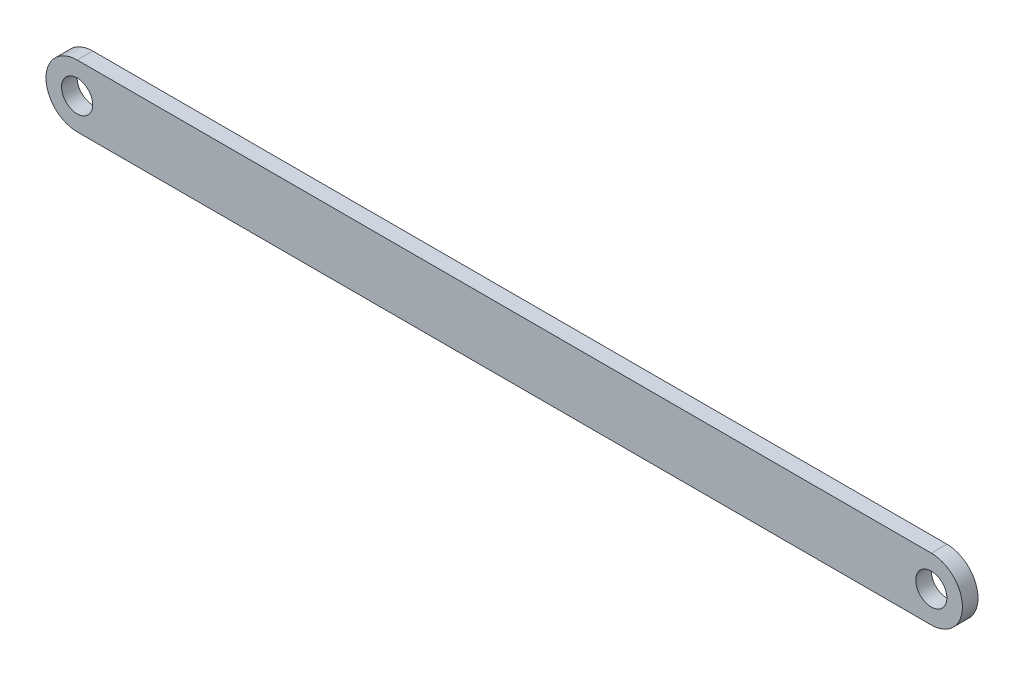
ISO-10303-21;
HEADER;
FILE_DESCRIPTION(('STEP AP214'),'2;1');
FILE_NAME('part.step','',(''),(''),'','','');
FILE_SCHEMA(('AUTOMOTIVE_DESIGN { 1 0 10303 214 1 1 1 1 }'));
ENDSEC;
DATA;
#1=APPLICATION_CONTEXT('core data for automotive mechanical design processes');
#2=APPLICATION_PROTOCOL_DEFINITION('international standard','automotive_design',2000,#1);
#3=PRODUCT_CONTEXT('',#1,'mechanical');
#4=PRODUCT('Part','Part','',(#3));
#5=PRODUCT_RELATED_PRODUCT_CATEGORY('part','',(#4));
#6=PRODUCT_DEFINITION_FORMATION('','',#4);
#7=PRODUCT_DEFINITION_CONTEXT('part definition',#1,'design');
#8=PRODUCT_DEFINITION('design','',#6,#7);
#9=PRODUCT_DEFINITION_SHAPE('','',#8);
#10=(LENGTH_UNIT() NAMED_UNIT(*) SI_UNIT(.MILLI.,.METRE.));
#11=(NAMED_UNIT(*) PLANE_ANGLE_UNIT() SI_UNIT($,.RADIAN.));
#12=(NAMED_UNIT(*) SI_UNIT($,.STERADIAN.) SOLID_ANGLE_UNIT());
#13=UNCERTAINTY_MEASURE_WITH_UNIT(LENGTH_MEASURE(1.E-05),#10,'distance_accuracy_value','');
#14=(GEOMETRIC_REPRESENTATION_CONTEXT(3) GLOBAL_UNCERTAINTY_ASSIGNED_CONTEXT((#13)) GLOBAL_UNIT_ASSIGNED_CONTEXT((#10,
#11,#12)) REPRESENTATION_CONTEXT('',''));
#15=CARTESIAN_POINT('',(0.,0.,0.));
#16=DIRECTION('',(0.,0.,1.));
#17=DIRECTION('',(1.,0.,0.));
#18=AXIS2_PLACEMENT_3D('',#15,#16,#17);
#19=CARTESIAN_POINT('',(27.435,0.,1.));
#20=DIRECTION('',(0.,0.,-1.));
#21=DIRECTION('',(-1.,0.,0.));
#22=AXIS2_PLACEMENT_3D('',#19,#20,#21);
#23=PLANE('',#22);
#24=CARTESIAN_POINT('',(27.435,0.,1.));
#25=DIRECTION('',(0.,0.,1.));
#26=DIRECTION('',(-1.,0.,0.));
#27=AXIS2_PLACEMENT_3D('',#24,#25,#26);
#28=CIRCLE('',#27,2.);
#29=CARTESIAN_POINT('',(27.435,-2.,1.));
#30=VERTEX_POINT('',#29);
#31=CARTESIAN_POINT('',(27.435,2.,1.));
#32=VERTEX_POINT('',#31);
#33=EDGE_CURVE('E94',#30,#32,#28,.T.);
#34=ORIENTED_EDGE('',*,*,#33,.T.);
#35=DIRECTION('',(-1.,0.,0.));
#36=VECTOR('',#35,1.);
#37=CARTESIAN_POINT('',(-27.435,2.,1.));
#38=LINE('',#37,#36);
#39=CARTESIAN_POINT('',(-27.435,2.,1.));
#40=VERTEX_POINT('',#39);
#41=EDGE_CURVE('E89',#32,#40,#38,.T.);
#42=ORIENTED_EDGE('',*,*,#41,.T.);
#43=CARTESIAN_POINT('',(-27.435,0.,1.));
#44=DIRECTION('',(0.,0.,1.));
#45=DIRECTION('',(1.,0.,0.));
#46=AXIS2_PLACEMENT_3D('',#43,#44,#45);
#47=CIRCLE('',#46,2.);
#48=CARTESIAN_POINT('',(-27.435,-2.,1.));
#49=VERTEX_POINT('',#48);
#50=EDGE_CURVE('E92',#40,#49,#47,.T.);
#51=ORIENTED_EDGE('',*,*,#50,.T.);
#52=DIRECTION('',(1.,0.,0.));
#53=VECTOR('',#52,1.);
#54=CARTESIAN_POINT('',(-27.435,-2.,1.));
#55=LINE('',#54,#53);
#56=EDGE_CURVE('E59',#49,#30,#55,.T.);
#57=ORIENTED_EDGE('',*,*,#56,.T.);
#58=EDGE_LOOP('',(#34,#42,#51,#57));
#59=FACE_BOUND('',#58,.T.);
#60=CARTESIAN_POINT('',(-27.435,0.,1.));
#61=DIRECTION('',(0.,0.,1.));
#62=DIRECTION('',(1.,0.,0.));
#63=AXIS2_PLACEMENT_3D('',#60,#61,#62);
#64=CIRCLE('',#63,1.);
#65=CARTESIAN_POINT('',(-26.435,0.,1.));
#66=VERTEX_POINT('',#65);
#67=EDGE_CURVE('E109',#66,#66,#64,.T.);
#68=ORIENTED_EDGE('',*,*,#67,.F.);
#69=EDGE_LOOP('',(#68));
#70=FACE_BOUND('',#69,.T.);
#71=CARTESIAN_POINT('',(27.435,0.,1.));
#72=DIRECTION('',(0.,0.,1.));
#73=DIRECTION('',(1.,0.,0.));
#74=AXIS2_PLACEMENT_3D('',#71,#72,#73);
#75=CIRCLE('',#74,1.);
#76=CARTESIAN_POINT('',(28.435,0.,1.));
#77=VERTEX_POINT('',#76);
#78=EDGE_CURVE('E124',#77,#77,#75,.T.);
#79=ORIENTED_EDGE('',*,*,#78,.F.);
#80=EDGE_LOOP('',(#79));
#81=FACE_BOUND('',#80,.T.);
#82=ADVANCED_FACE('F42',(#59,#70,#81),#23,.F.);
#83=CARTESIAN_POINT('',(27.435,0.,0.));
#84=DIRECTION('',(0.,0.,-1.));
#85=DIRECTION('',(-1.,0.,0.));
#86=AXIS2_PLACEMENT_3D('',#83,#84,#85);
#87=PLANE('',#86);
#88=CARTESIAN_POINT('',(-27.435,0.,0.));
#89=DIRECTION('',(0.,0.,1.));
#90=DIRECTION('',(1.,0.,0.));
#91=AXIS2_PLACEMENT_3D('',#88,#89,#90);
#92=CIRCLE('',#91,1.);
#93=CARTESIAN_POINT('',(-26.435,0.,0.));
#94=VERTEX_POINT('',#93);
#95=EDGE_CURVE('E121',#94,#94,#92,.T.);
#96=ORIENTED_EDGE('',*,*,#95,.T.);
#97=EDGE_LOOP('',(#96));
#98=FACE_BOUND('',#97,.T.);
#99=CARTESIAN_POINT('',(27.435,0.,0.));
#100=DIRECTION('',(0.,0.,1.));
#101=DIRECTION('',(-1.,0.,0.));
#102=AXIS2_PLACEMENT_3D('',#99,#100,#101);
#103=CIRCLE('',#102,2.);
#104=CARTESIAN_POINT('',(27.435,-2.,0.));
#105=VERTEX_POINT('',#104);
#106=CARTESIAN_POINT('',(27.435,2.,0.));
#107=VERTEX_POINT('',#106);
#108=EDGE_CURVE('E106',#105,#107,#103,.T.);
#109=ORIENTED_EDGE('',*,*,#108,.F.);
#110=DIRECTION('',(1.,0.,0.));
#111=VECTOR('',#110,1.);
#112=CARTESIAN_POINT('',(-27.435,-2.,0.));
#113=LINE('',#112,#111);
#114=CARTESIAN_POINT('',(-27.435,-2.,0.));
#115=VERTEX_POINT('',#114);
#116=EDGE_CURVE('E82',#115,#105,#113,.T.);
#117=ORIENTED_EDGE('',*,*,#116,.F.);
#118=CARTESIAN_POINT('',(-27.435,0.,0.));
#119=DIRECTION('',(0.,0.,1.));
#120=DIRECTION('',(1.,0.,0.));
#121=AXIS2_PLACEMENT_3D('',#118,#119,#120);
#122=CIRCLE('',#121,2.);
#123=CARTESIAN_POINT('',(-27.435,2.,0.));
#124=VERTEX_POINT('',#123);
#125=EDGE_CURVE('E76',#124,#115,#122,.T.);
#126=ORIENTED_EDGE('',*,*,#125,.F.);
#127=DIRECTION('',(-1.,0.,0.));
#128=VECTOR('',#127,1.);
#129=CARTESIAN_POINT('',(-27.435,2.,0.));
#130=LINE('',#129,#128);
#131=EDGE_CURVE('E98',#107,#124,#130,.T.);
#132=ORIENTED_EDGE('',*,*,#131,.F.);
#133=EDGE_LOOP('',(#109,#117,#126,#132));
#134=FACE_BOUND('',#133,.T.);
#135=CARTESIAN_POINT('',(27.435,0.,0.));
#136=DIRECTION('',(0.,0.,1.));
#137=DIRECTION('',(1.,0.,0.));
#138=AXIS2_PLACEMENT_3D('',#135,#136,#137);
#139=CIRCLE('',#138,1.);
#140=CARTESIAN_POINT('',(28.435,0.,0.));
#141=VERTEX_POINT('',#140);
#142=EDGE_CURVE('E127',#141,#141,#139,.T.);
#143=ORIENTED_EDGE('',*,*,#142,.T.);
#144=EDGE_LOOP('',(#143));
#145=FACE_BOUND('',#144,.T.);
#146=ADVANCED_FACE('F117',(#98,#134,#145),#87,.T.);
#147=CARTESIAN_POINT('',(27.435,0.,1.));
#148=DIRECTION('',(0.,0.,-1.));
#149=DIRECTION('',(-1.,0.,0.));
#150=AXIS2_PLACEMENT_3D('',#147,#148,#149);
#151=CYLINDRICAL_SURFACE('',#150,2.);
#152=ORIENTED_EDGE('',*,*,#108,.T.);
#153=DIRECTION('',(0.,0.,-1.));
#154=VECTOR('',#153,1.);
#155=CARTESIAN_POINT('',(27.435,2.,1.));
#156=LINE('',#155,#154);
#157=EDGE_CURVE('E11',#32,#107,#156,.T.);
#158=ORIENTED_EDGE('',*,*,#157,.F.);
#159=ORIENTED_EDGE('',*,*,#33,.F.);
#160=DIRECTION('',(0.,0.,-1.));
#161=VECTOR('',#160,1.);
#162=CARTESIAN_POINT('',(27.435,-2.,1.));
#163=LINE('',#162,#161);
#164=EDGE_CURVE('E102',#30,#105,#163,.T.);
#165=ORIENTED_EDGE('',*,*,#164,.T.);
#166=EDGE_LOOP('',(#152,#158,#159,#165));
#167=FACE_BOUND('',#166,.T.);
#168=ADVANCED_FACE('F44',(#167),#151,.T.);
#169=CARTESIAN_POINT('',(-27.435,2.,1.));
#170=DIRECTION('',(0.,-1.,0.));
#171=DIRECTION('',(0.,0.,-1.));
#172=AXIS2_PLACEMENT_3D('',#169,#170,#171);
#173=PLANE('',#172);
#174=ORIENTED_EDGE('',*,*,#131,.T.);
#175=DIRECTION('',(0.,0.,-1.));
#176=VECTOR('',#175,1.);
#177=CARTESIAN_POINT('',(-27.435,2.,1.));
#178=LINE('',#177,#176);
#179=EDGE_CURVE('E51',#40,#124,#178,.T.);
#180=ORIENTED_EDGE('',*,*,#179,.F.);
#181=ORIENTED_EDGE('',*,*,#41,.F.);
#182=ORIENTED_EDGE('',*,*,#157,.T.);
#183=EDGE_LOOP('',(#174,#180,#181,#182));
#184=FACE_BOUND('',#183,.T.);
#185=ADVANCED_FACE('F97',(#184),#173,.F.);
#186=CARTESIAN_POINT('',(-27.435,0.,1.));
#187=DIRECTION('',(0.,0.,-1.));
#188=DIRECTION('',(-1.,0.,0.));
#189=AXIS2_PLACEMENT_3D('',#186,#187,#188);
#190=CYLINDRICAL_SURFACE('',#189,2.);
#191=ORIENTED_EDGE('',*,*,#125,.T.);
#192=DIRECTION('',(0.,0.,-1.));
#193=VECTOR('',#192,1.);
#194=CARTESIAN_POINT('',(-27.435,-2.,1.));
#195=LINE('',#194,#193);
#196=EDGE_CURVE('E99',#49,#115,#195,.T.);
#197=ORIENTED_EDGE('',*,*,#196,.F.);
#198=ORIENTED_EDGE('',*,*,#50,.F.);
#199=ORIENTED_EDGE('',*,*,#179,.T.);
#200=EDGE_LOOP('',(#191,#197,#198,#199));
#201=FACE_BOUND('',#200,.T.);
#202=ADVANCED_FACE('F100',(#201),#190,.T.);
#203=CARTESIAN_POINT('',(-27.435,-2.,1.));
#204=DIRECTION('',(0.,1.,0.));
#205=DIRECTION('',(0.,0.,1.));
#206=AXIS2_PLACEMENT_3D('',#203,#204,#205);
#207=PLANE('',#206);
#208=ORIENTED_EDGE('',*,*,#116,.T.);
#209=ORIENTED_EDGE('',*,*,#164,.F.);
#210=ORIENTED_EDGE('',*,*,#56,.F.);
#211=ORIENTED_EDGE('',*,*,#196,.T.);
#212=EDGE_LOOP('',(#208,#209,#210,#211));
#213=FACE_BOUND('',#212,.T.);
#214=ADVANCED_FACE('F114',(#213),#207,.F.);
#215=CARTESIAN_POINT('',(-27.435,0.,1.));
#216=DIRECTION('',(0.,0.,-1.));
#217=DIRECTION('',(-1.,0.,0.));
#218=AXIS2_PLACEMENT_3D('',#215,#216,#217);
#219=CYLINDRICAL_SURFACE('',#218,1.);
#220=ORIENTED_EDGE('',*,*,#67,.T.);
#221=EDGE_LOOP('',(#220));
#222=FACE_BOUND('',#221,.T.);
#223=ORIENTED_EDGE('',*,*,#95,.F.);
#224=EDGE_LOOP('',(#223));
#225=FACE_BOUND('',#224,.T.);
#226=ADVANCED_FACE('F144',(#222,#225),#219,.F.);
#227=CARTESIAN_POINT('',(27.435,0.,1.));
#228=DIRECTION('',(0.,0.,-1.));
#229=DIRECTION('',(-1.,0.,0.));
#230=AXIS2_PLACEMENT_3D('',#227,#228,#229);
#231=CYLINDRICAL_SURFACE('',#230,1.);
#232=ORIENTED_EDGE('',*,*,#78,.T.);
#233=EDGE_LOOP('',(#232));
#234=FACE_BOUND('',#233,.T.);
#235=ORIENTED_EDGE('',*,*,#142,.F.);
#236=EDGE_LOOP('',(#235));
#237=FACE_BOUND('',#236,.T.);
#238=ADVANCED_FACE('F133',(#234,#237),#231,.F.);
#239=CLOSED_SHELL('',(#82,#146,#168,#185,#202,#214,#226,#238));
#240=MANIFOLD_SOLID_BREP('B2',#239);
#241=ADVANCED_BREP_SHAPE_REPRESENTATION('',(#18,#240),#14);
#242=SHAPE_DEFINITION_REPRESENTATION(#9,#241);
ENDSEC;
END-ISO-10303-21;
